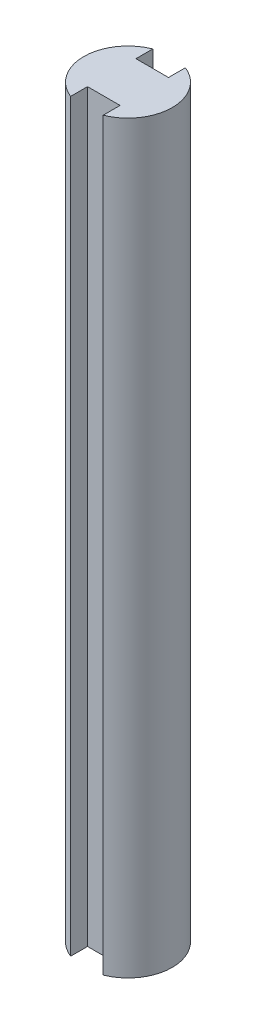
ISO-10303-21;
HEADER;
FILE_DESCRIPTION(('STEP AP214'),'2;1');
FILE_NAME('part.step','',(''),(''),'','','');
FILE_SCHEMA(('AUTOMOTIVE_DESIGN { 1 0 10303 214 1 1 1 1 }'));
ENDSEC;
DATA;
#1=APPLICATION_CONTEXT('core data for automotive mechanical design processes');
#2=APPLICATION_PROTOCOL_DEFINITION('international standard','automotive_design',2000,#1);
#3=PRODUCT_CONTEXT('',#1,'mechanical');
#4=PRODUCT('Part','Part','',(#3));
#5=PRODUCT_RELATED_PRODUCT_CATEGORY('part','',(#4));
#6=PRODUCT_DEFINITION_FORMATION('','',#4);
#7=PRODUCT_DEFINITION_CONTEXT('part definition',#1,'design');
#8=PRODUCT_DEFINITION('design','',#6,#7);
#9=PRODUCT_DEFINITION_SHAPE('','',#8);
#10=(LENGTH_UNIT() NAMED_UNIT(*) SI_UNIT(.MILLI.,.METRE.));
#11=(NAMED_UNIT(*) PLANE_ANGLE_UNIT() SI_UNIT($,.RADIAN.));
#12=(NAMED_UNIT(*) SI_UNIT($,.STERADIAN.) SOLID_ANGLE_UNIT());
#13=UNCERTAINTY_MEASURE_WITH_UNIT(LENGTH_MEASURE(1.E-05),#10,'distance_accuracy_value','');
#14=(GEOMETRIC_REPRESENTATION_CONTEXT(3) GLOBAL_UNCERTAINTY_ASSIGNED_CONTEXT((#13)) GLOBAL_UNIT_ASSIGNED_CONTEXT((#10,
#11,#12)) REPRESENTATION_CONTEXT('',''));
#15=CARTESIAN_POINT('',(0.,0.,0.));
#16=DIRECTION('',(0.,0.,1.));
#17=DIRECTION('',(1.,0.,0.));
#18=AXIS2_PLACEMENT_3D('',#15,#16,#17);
#19=CARTESIAN_POINT('',(1.75,80.,0.));
#20=DIRECTION('',(1.,0.,0.));
#21=DIRECTION('',(0.,0.,-1.));
#22=AXIS2_PLACEMENT_3D('',#19,#20,#21);
#23=PLANE('',#22);
#24=DIRECTION('',(0.,0.,1.));
#25=VECTOR('',#24,1.);
#26=CARTESIAN_POINT('',(1.75,0.,0.));
#27=LINE('',#26,#25);
#28=CARTESIAN_POINT('',(1.75,0.,2.6));
#29=VERTEX_POINT('',#28);
#30=CARTESIAN_POINT('',(1.75,0.,4.41588043316392));
#31=VERTEX_POINT('',#30);
#32=EDGE_CURVE('E129',#29,#31,#27,.T.);
#33=ORIENTED_EDGE('',*,*,#32,.T.);
#34=DIRECTION('',(0.,-1.,0.));
#35=VECTOR('',#34,1.);
#36=CARTESIAN_POINT('',(1.75,80.,4.41588043316392));
#37=LINE('',#36,#35);
#38=CARTESIAN_POINT('',(1.75,80.,4.41588043316392));
#39=VERTEX_POINT('',#38);
#40=EDGE_CURVE('E11',#39,#31,#37,.T.);
#41=ORIENTED_EDGE('',*,*,#40,.F.);
#42=DIRECTION('',(0.,0.,1.));
#43=VECTOR('',#42,1.);
#44=CARTESIAN_POINT('',(1.75,80.,0.));
#45=LINE('',#44,#43);
#46=CARTESIAN_POINT('',(1.75,80.,2.6));
#47=VERTEX_POINT('',#46);
#48=EDGE_CURVE('E146',#47,#39,#45,.T.);
#49=ORIENTED_EDGE('',*,*,#48,.F.);
#50=DIRECTION('',(0.,-1.,0.));
#51=VECTOR('',#50,1.);
#52=CARTESIAN_POINT('',(1.75,80.,2.6));
#53=LINE('',#52,#51);
#54=EDGE_CURVE('E124',#47,#29,#53,.T.);
#55=ORIENTED_EDGE('',*,*,#54,.T.);
#56=EDGE_LOOP('',(#33,#41,#49,#55));
#57=FACE_BOUND('',#56,.T.);
#58=ADVANCED_FACE('F32',(#57),#23,.F.);
#59=CARTESIAN_POINT('',(0.,80.,0.));
#60=DIRECTION('',(0.,-1.,0.));
#61=DIRECTION('',(0.,0.,-1.));
#62=AXIS2_PLACEMENT_3D('',#59,#60,#61);
#63=CYLINDRICAL_SURFACE('',#62,4.75);
#64=CARTESIAN_POINT('',(0.,0.,0.));
#65=DIRECTION('',(0.,1.,0.));
#66=DIRECTION('',(0.,0.,1.));
#67=AXIS2_PLACEMENT_3D('',#64,#65,#66);
#68=CIRCLE('',#67,4.75);
#69=CARTESIAN_POINT('',(1.75,0.,-4.41588043316392));
#70=VERTEX_POINT('',#69);
#71=EDGE_CURVE('E132',#31,#70,#68,.T.);
#72=ORIENTED_EDGE('',*,*,#71,.T.);
#73=DIRECTION('',(0.,-1.,0.));
#74=VECTOR('',#73,1.);
#75=CARTESIAN_POINT('',(1.75,80.,-4.41588043316392));
#76=LINE('',#75,#74);
#77=CARTESIAN_POINT('',(1.75,80.,-4.41588043316392));
#78=VERTEX_POINT('',#77);
#79=EDGE_CURVE('E40',#78,#70,#76,.T.);
#80=ORIENTED_EDGE('',*,*,#79,.F.);
#81=CARTESIAN_POINT('',(0.,80.,0.));
#82=DIRECTION('',(0.,1.,0.));
#83=DIRECTION('',(0.,0.,1.));
#84=AXIS2_PLACEMENT_3D('',#81,#82,#83);
#85=CIRCLE('',#84,4.75);
#86=EDGE_CURVE('E91',#39,#78,#85,.T.);
#87=ORIENTED_EDGE('',*,*,#86,.F.);
#88=ORIENTED_EDGE('',*,*,#40,.T.);
#89=EDGE_LOOP('',(#72,#80,#87,#88));
#90=FACE_BOUND('',#89,.T.);
#91=ADVANCED_FACE('F159',(#90),#63,.T.);
#92=CARTESIAN_POINT('',(1.75,80.,0.));
#93=DIRECTION('',(-1.,0.,0.));
#94=DIRECTION('',(0.,0.,1.));
#95=AXIS2_PLACEMENT_3D('',#92,#93,#94);
#96=PLANE('',#95);
#97=DIRECTION('',(0.,0.,-1.));
#98=VECTOR('',#97,1.);
#99=CARTESIAN_POINT('',(1.75,0.,0.));
#100=LINE('',#99,#98);
#101=CARTESIAN_POINT('',(1.75,0.,-2.6));
#102=VERTEX_POINT('',#101);
#103=EDGE_CURVE('E135',#102,#70,#100,.T.);
#104=ORIENTED_EDGE('',*,*,#103,.F.);
#105=DIRECTION('',(0.,-1.,0.));
#106=VECTOR('',#105,1.);
#107=CARTESIAN_POINT('',(1.75,80.,-2.6));
#108=LINE('',#107,#106);
#109=CARTESIAN_POINT('',(1.75,80.,-2.6));
#110=VERTEX_POINT('',#109);
#111=EDGE_CURVE('E152',#110,#102,#108,.T.);
#112=ORIENTED_EDGE('',*,*,#111,.F.);
#113=DIRECTION('',(0.,0.,-1.));
#114=VECTOR('',#113,1.);
#115=CARTESIAN_POINT('',(1.75,80.,0.));
#116=LINE('',#115,#114);
#117=EDGE_CURVE('E158',#110,#78,#116,.T.);
#118=ORIENTED_EDGE('',*,*,#117,.T.);
#119=ORIENTED_EDGE('',*,*,#79,.T.);
#120=EDGE_LOOP('',(#104,#112,#118,#119));
#121=FACE_BOUND('',#120,.T.);
#122=ADVANCED_FACE('F156',(#121),#96,.T.);
#123=CARTESIAN_POINT('',(0.,80.,-2.6));
#124=DIRECTION('',(0.,0.,-1.));
#125=DIRECTION('',(-1.,0.,0.));
#126=AXIS2_PLACEMENT_3D('',#123,#124,#125);
#127=PLANE('',#126);
#128=DIRECTION('',(1.,0.,0.));
#129=VECTOR('',#128,1.);
#130=CARTESIAN_POINT('',(0.,0.,-2.6));
#131=LINE('',#130,#129);
#132=CARTESIAN_POINT('',(-1.75,0.,-2.6));
#133=VERTEX_POINT('',#132);
#134=EDGE_CURVE('E138',#133,#102,#131,.T.);
#135=ORIENTED_EDGE('',*,*,#134,.F.);
#136=DIRECTION('',(0.,-1.,0.));
#137=VECTOR('',#136,1.);
#138=CARTESIAN_POINT('',(-1.75,80.,-2.6));
#139=LINE('',#138,#137);
#140=CARTESIAN_POINT('',(-1.75,80.,-2.6));
#141=VERTEX_POINT('',#140);
#142=EDGE_CURVE('E150',#141,#133,#139,.T.);
#143=ORIENTED_EDGE('',*,*,#142,.F.);
#144=DIRECTION('',(1.,0.,0.));
#145=VECTOR('',#144,1.);
#146=CARTESIAN_POINT('',(0.,80.,-2.6));
#147=LINE('',#146,#145);
#148=EDGE_CURVE('E169',#141,#110,#147,.T.);
#149=ORIENTED_EDGE('',*,*,#148,.T.);
#150=ORIENTED_EDGE('',*,*,#111,.T.);
#151=EDGE_LOOP('',(#135,#143,#149,#150));
#152=FACE_BOUND('',#151,.T.);
#153=ADVANCED_FACE('F167',(#152),#127,.T.);
#154=CARTESIAN_POINT('',(-1.75,80.,0.));
#155=DIRECTION('',(1.,0.,0.));
#156=DIRECTION('',(0.,0.,-1.));
#157=AXIS2_PLACEMENT_3D('',#154,#155,#156);
#158=PLANE('',#157);
#159=DIRECTION('',(0.,0.,1.));
#160=VECTOR('',#159,1.);
#161=CARTESIAN_POINT('',(-1.75,0.,0.));
#162=LINE('',#161,#160);
#163=CARTESIAN_POINT('',(-1.75,0.,-4.41588043316392));
#164=VERTEX_POINT('',#163);
#165=EDGE_CURVE('E141',#164,#133,#162,.T.);
#166=ORIENTED_EDGE('',*,*,#165,.F.);
#167=DIRECTION('',(0.,-1.,0.));
#168=VECTOR('',#167,1.);
#169=CARTESIAN_POINT('',(-1.75,80.,-4.41588043316392));
#170=LINE('',#169,#168);
#171=CARTESIAN_POINT('',(-1.75,80.,-4.41588043316392));
#172=VERTEX_POINT('',#171);
#173=EDGE_CURVE('E119',#172,#164,#170,.T.);
#174=ORIENTED_EDGE('',*,*,#173,.F.);
#175=DIRECTION('',(0.,0.,1.));
#176=VECTOR('',#175,1.);
#177=CARTESIAN_POINT('',(-1.75,80.,0.));
#178=LINE('',#177,#176);
#179=EDGE_CURVE('E112',#172,#141,#178,.T.);
#180=ORIENTED_EDGE('',*,*,#179,.T.);
#181=ORIENTED_EDGE('',*,*,#142,.T.);
#182=EDGE_LOOP('',(#166,#174,#180,#181));
#183=FACE_BOUND('',#182,.T.);
#184=ADVANCED_FACE('F175',(#183),#158,.T.);
#185=CARTESIAN_POINT('',(-1.75,0.,4.41588043316392));
#186=VERTEX_POINT('',#185);
#187=EDGE_CURVE('E118',#164,#186,#68,.T.);
#188=ORIENTED_EDGE('',*,*,#187,.T.);
#189=DIRECTION('',(0.,-1.,0.));
#190=VECTOR('',#189,1.);
#191=CARTESIAN_POINT('',(-1.75,80.,4.41588043316392));
#192=LINE('',#191,#190);
#193=CARTESIAN_POINT('',(-1.75,80.,4.41588043316392));
#194=VERTEX_POINT('',#193);
#195=EDGE_CURVE('E115',#194,#186,#192,.T.);
#196=ORIENTED_EDGE('',*,*,#195,.F.);
#197=EDGE_CURVE('E105',#172,#194,#85,.T.);
#198=ORIENTED_EDGE('',*,*,#197,.F.);
#199=ORIENTED_EDGE('',*,*,#173,.T.);
#200=EDGE_LOOP('',(#188,#196,#198,#199));
#201=FACE_BOUND('',#200,.T.);
#202=ADVANCED_FACE('F116',(#201),#63,.T.);
#203=CARTESIAN_POINT('',(-1.75,80.,0.));
#204=DIRECTION('',(-1.,0.,0.));
#205=DIRECTION('',(0.,0.,1.));
#206=AXIS2_PLACEMENT_3D('',#203,#204,#205);
#207=PLANE('',#206);
#208=DIRECTION('',(0.,0.,-1.));
#209=VECTOR('',#208,1.);
#210=CARTESIAN_POINT('',(-1.75,0.,0.));
#211=LINE('',#210,#209);
#212=CARTESIAN_POINT('',(-1.75,0.,2.6));
#213=VERTEX_POINT('',#212);
#214=EDGE_CURVE('E77',#186,#213,#211,.T.);
#215=ORIENTED_EDGE('',*,*,#214,.T.);
#216=DIRECTION('',(0.,-1.,0.));
#217=VECTOR('',#216,1.);
#218=CARTESIAN_POINT('',(-1.75,80.,2.6));
#219=LINE('',#218,#217);
#220=CARTESIAN_POINT('',(-1.75,80.,2.6));
#221=VERTEX_POINT('',#220);
#222=EDGE_CURVE('E120',#221,#213,#219,.T.);
#223=ORIENTED_EDGE('',*,*,#222,.F.);
#224=DIRECTION('',(0.,0.,-1.));
#225=VECTOR('',#224,1.);
#226=CARTESIAN_POINT('',(-1.75,80.,0.));
#227=LINE('',#226,#225);
#228=EDGE_CURVE('E109',#194,#221,#227,.T.);
#229=ORIENTED_EDGE('',*,*,#228,.F.);
#230=ORIENTED_EDGE('',*,*,#195,.T.);
#231=EDGE_LOOP('',(#215,#223,#229,#230));
#232=FACE_BOUND('',#231,.T.);
#233=ADVANCED_FACE('F122',(#232),#207,.F.);
#234=CARTESIAN_POINT('',(0.,80.,2.6));
#235=DIRECTION('',(0.,0.,-1.));
#236=DIRECTION('',(-1.,0.,0.));
#237=AXIS2_PLACEMENT_3D('',#234,#235,#236);
#238=PLANE('',#237);
#239=DIRECTION('',(1.,0.,0.));
#240=VECTOR('',#239,1.);
#241=CARTESIAN_POINT('',(0.,0.,2.6));
#242=LINE('',#241,#240);
#243=EDGE_CURVE('E83',#213,#29,#242,.T.);
#244=ORIENTED_EDGE('',*,*,#243,.T.);
#245=ORIENTED_EDGE('',*,*,#54,.F.);
#246=DIRECTION('',(1.,0.,0.));
#247=VECTOR('',#246,1.);
#248=CARTESIAN_POINT('',(0.,80.,2.6));
#249=LINE('',#248,#247);
#250=EDGE_CURVE('E48',#221,#47,#249,.T.);
#251=ORIENTED_EDGE('',*,*,#250,.F.);
#252=ORIENTED_EDGE('',*,*,#222,.T.);
#253=EDGE_LOOP('',(#244,#245,#251,#252));
#254=FACE_BOUND('',#253,.T.);
#255=ADVANCED_FACE('F194',(#254),#238,.F.);
#256=CARTESIAN_POINT('',(0.,80.,0.));
#257=DIRECTION('',(0.,1.,0.));
#258=DIRECTION('',(0.,0.,1.));
#259=AXIS2_PLACEMENT_3D('',#256,#257,#258);
#260=PLANE('',#259);
#261=ORIENTED_EDGE('',*,*,#48,.T.);
#262=ORIENTED_EDGE('',*,*,#86,.T.);
#263=ORIENTED_EDGE('',*,*,#117,.F.);
#264=ORIENTED_EDGE('',*,*,#148,.F.);
#265=ORIENTED_EDGE('',*,*,#179,.F.);
#266=ORIENTED_EDGE('',*,*,#197,.T.);
#267=ORIENTED_EDGE('',*,*,#228,.T.);
#268=ORIENTED_EDGE('',*,*,#250,.T.);
#269=EDGE_LOOP('',(#261,#262,#263,#264,#265,#266,#267,#268));
#270=FACE_BOUND('',#269,.T.);
#271=ADVANCED_FACE('F107',(#270),#260,.T.);
#272=CARTESIAN_POINT('',(0.,0.,0.));
#273=DIRECTION('',(0.,1.,0.));
#274=DIRECTION('',(0.,0.,1.));
#275=AXIS2_PLACEMENT_3D('',#272,#273,#274);
#276=PLANE('',#275);
#277=ORIENTED_EDGE('',*,*,#32,.F.);
#278=ORIENTED_EDGE('',*,*,#243,.F.);
#279=ORIENTED_EDGE('',*,*,#214,.F.);
#280=ORIENTED_EDGE('',*,*,#187,.F.);
#281=ORIENTED_EDGE('',*,*,#165,.T.);
#282=ORIENTED_EDGE('',*,*,#134,.T.);
#283=ORIENTED_EDGE('',*,*,#103,.T.);
#284=ORIENTED_EDGE('',*,*,#71,.F.);
#285=EDGE_LOOP('',(#277,#278,#279,#280,#281,#282,#283,#284));
#286=FACE_BOUND('',#285,.T.);
#287=ADVANCED_FACE('F163',(#286),#276,.F.);
#288=CLOSED_SHELL('',(#58,#91,#122,#153,#184,#202,#233,#255,#271,#287));
#289=MANIFOLD_SOLID_BREP('B2',#288);
#290=ADVANCED_BREP_SHAPE_REPRESENTATION('',(#18,#289),#14);
#291=SHAPE_DEFINITION_REPRESENTATION(#9,#290);
ENDSEC;
END-ISO-10303-21;
